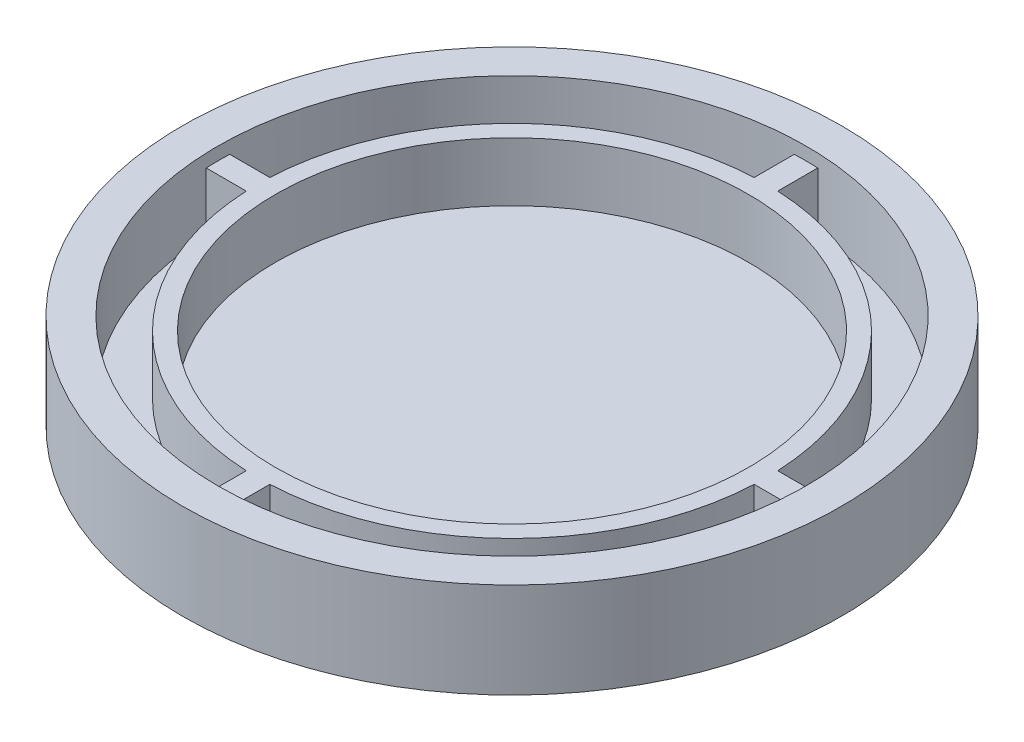
ISO-10303-21;
HEADER;
FILE_DESCRIPTION(('STEP AP214'),'2;1');
FILE_NAME('part.step','',(''),(''),'','','');
FILE_SCHEMA(('AUTOMOTIVE_DESIGN { 1 0 10303 214 1 1 1 1 }'));
ENDSEC;
DATA;
#1=APPLICATION_CONTEXT('core data for automotive mechanical design processes');
#2=APPLICATION_PROTOCOL_DEFINITION('international standard','automotive_design',2000,#1);
#3=PRODUCT_CONTEXT('',#1,'mechanical');
#4=PRODUCT('Part','Part','',(#3));
#5=PRODUCT_RELATED_PRODUCT_CATEGORY('part','',(#4));
#6=PRODUCT_DEFINITION_FORMATION('','',#4);
#7=PRODUCT_DEFINITION_CONTEXT('part definition',#1,'design');
#8=PRODUCT_DEFINITION('design','',#6,#7);
#9=PRODUCT_DEFINITION_SHAPE('','',#8);
#10=(LENGTH_UNIT() NAMED_UNIT(*) SI_UNIT(.MILLI.,.METRE.));
#11=(NAMED_UNIT(*) PLANE_ANGLE_UNIT() SI_UNIT($,.RADIAN.));
#12=(NAMED_UNIT(*) SI_UNIT($,.STERADIAN.) SOLID_ANGLE_UNIT());
#13=UNCERTAINTY_MEASURE_WITH_UNIT(LENGTH_MEASURE(1.E-05),#10,'distance_accuracy_value','');
#14=(GEOMETRIC_REPRESENTATION_CONTEXT(3) GLOBAL_UNCERTAINTY_ASSIGNED_CONTEXT((#13)) GLOBAL_UNIT_ASSIGNED_CONTEXT((#10,
#11,#12)) REPRESENTATION_CONTEXT('',''));
#15=CARTESIAN_POINT('',(0.,0.,0.));
#16=DIRECTION('',(0.,0.,1.));
#17=DIRECTION('',(1.,0.,0.));
#18=AXIS2_PLACEMENT_3D('',#15,#16,#17);
#19=CARTESIAN_POINT('',(0.,8.,0.));
#20=DIRECTION('',(0.,-1.,0.));
#21=DIRECTION('',(0.,0.,-1.));
#22=AXIS2_PLACEMENT_3D('',#19,#20,#21);
#23=CYLINDRICAL_SURFACE('',#22,25.);
#24=CARTESIAN_POINT('',(0.,6.1,0.));
#25=DIRECTION('',(0.,1.,0.));
#26=DIRECTION('',(0.,0.,1.));
#27=AXIS2_PLACEMENT_3D('',#24,#25,#26);
#28=CIRCLE('',#27,25.);
#29=CARTESIAN_POINT('',(0.,6.1,25.));
#30=VERTEX_POINT('',#29);
#31=EDGE_CURVE('E55',#30,#30,#28,.T.);
#32=ORIENTED_EDGE('',*,*,#31,.T.);
#33=EDGE_LOOP('',(#32));
#34=FACE_BOUND('',#33,.T.);
#35=CARTESIAN_POINT('',(0.,5.,0.));
#36=DIRECTION('',(0.,1.,0.));
#37=DIRECTION('',(0.,0.,1.));
#38=AXIS2_PLACEMENT_3D('',#35,#36,#37);
#39=CIRCLE('',#38,25.);
#40=CARTESIAN_POINT('',(24.9799919935936,5.,1.));
#41=VERTEX_POINT('',#40);
#42=CARTESIAN_POINT('',(24.9799919935936,5.,-1.));
#43=VERTEX_POINT('',#42);
#44=EDGE_CURVE('E320',#41,#43,#39,.T.);
#45=ORIENTED_EDGE('',*,*,#44,.F.);
#46=DIRECTION('',(0.,-1.,0.));
#47=VECTOR('',#46,1.);
#48=CARTESIAN_POINT('',(24.9799919935936,8.,1.));
#49=LINE('',#48,#47);
#50=CARTESIAN_POINT('',(24.9799919935936,0.,1.));
#51=VERTEX_POINT('',#50);
#52=EDGE_CURVE('E173',#41,#51,#49,.T.);
#53=ORIENTED_EDGE('',*,*,#52,.T.);
#54=CARTESIAN_POINT('',(0.,0.,0.));
#55=DIRECTION('',(0.,1.,0.));
#56=DIRECTION('',(0.,0.,1.));
#57=AXIS2_PLACEMENT_3D('',#54,#55,#56);
#58=CIRCLE('',#57,25.);
#59=CARTESIAN_POINT('',(1.,0.,24.9799919935936));
#60=VERTEX_POINT('',#59);
#61=EDGE_CURVE('E375',#60,#51,#58,.T.);
#62=ORIENTED_EDGE('',*,*,#61,.F.);
#63=DIRECTION('',(0.,-1.,0.));
#64=VECTOR('',#63,1.);
#65=CARTESIAN_POINT('',(1.,8.,24.9799919935936));
#66=LINE('',#65,#64);
#67=CARTESIAN_POINT('',(1.,5.,24.9799919935936));
#68=VERTEX_POINT('',#67);
#69=EDGE_CURVE('E283',#60,#68,#66,.F.);
#70=ORIENTED_EDGE('',*,*,#69,.T.);
#71=CARTESIAN_POINT('',(0.,5.,0.));
#72=DIRECTION('',(0.,1.,0.));
#73=DIRECTION('',(0.,0.,1.));
#74=AXIS2_PLACEMENT_3D('',#71,#72,#73);
#75=CIRCLE('',#74,25.);
#76=CARTESIAN_POINT('',(-1.,5.,24.9799919935936));
#77=VERTEX_POINT('',#76);
#78=EDGE_CURVE('E261',#77,#68,#75,.T.);
#79=ORIENTED_EDGE('',*,*,#78,.F.);
#80=DIRECTION('',(0.,-1.,0.));
#81=VECTOR('',#80,1.);
#82=CARTESIAN_POINT('',(-1.,8.,24.9799919935936));
#83=LINE('',#82,#81);
#84=CARTESIAN_POINT('',(-1.,0.,24.9799919935936));
#85=VERTEX_POINT('',#84);
#86=EDGE_CURVE('E279',#77,#85,#83,.T.);
#87=ORIENTED_EDGE('',*,*,#86,.T.);
#88=CARTESIAN_POINT('',(-24.9799919935936,0.,1.));
#89=VERTEX_POINT('',#88);
#90=EDGE_CURVE('E61',#89,#85,#58,.T.);
#91=ORIENTED_EDGE('',*,*,#90,.F.);
#92=DIRECTION('',(0.,-1.,0.));
#93=VECTOR('',#92,1.);
#94=CARTESIAN_POINT('',(-24.9799919935936,8.,1.));
#95=LINE('',#94,#93);
#96=CARTESIAN_POINT('',(-24.9799919935936,5.,1.));
#97=VERTEX_POINT('',#96);
#98=EDGE_CURVE('E249',#89,#97,#95,.F.);
#99=ORIENTED_EDGE('',*,*,#98,.T.);
#100=CARTESIAN_POINT('',(0.,5.,0.));
#101=DIRECTION('',(0.,1.,0.));
#102=DIRECTION('',(0.,0.,1.));
#103=AXIS2_PLACEMENT_3D('',#100,#101,#102);
#104=CIRCLE('',#103,25.);
#105=CARTESIAN_POINT('',(-24.9799919935936,5.,-1.));
#106=VERTEX_POINT('',#105);
#107=EDGE_CURVE('E253',#106,#97,#104,.T.);
#108=ORIENTED_EDGE('',*,*,#107,.F.);
#109=DIRECTION('',(0.,-1.,0.));
#110=VECTOR('',#109,1.);
#111=CARTESIAN_POINT('',(-24.9799919935936,8.,-1.));
#112=LINE('',#111,#110);
#113=CARTESIAN_POINT('',(-24.9799919935936,0.,-1.));
#114=VERTEX_POINT('',#113);
#115=EDGE_CURVE('E245',#106,#114,#112,.T.);
#116=ORIENTED_EDGE('',*,*,#115,.T.);
#117=CARTESIAN_POINT('',(-1.,0.,-24.9799919935936));
#118=VERTEX_POINT('',#117);
#119=EDGE_CURVE('E371',#118,#114,#58,.T.);
#120=ORIENTED_EDGE('',*,*,#119,.F.);
#121=DIRECTION('',(0.,-1.,0.));
#122=VECTOR('',#121,1.);
#123=CARTESIAN_POINT('',(-1.,8.,-24.9799919935936));
#124=LINE('',#123,#122);
#125=CARTESIAN_POINT('',(-1.,5.,-24.9799919935936));
#126=VERTEX_POINT('',#125);
#127=EDGE_CURVE('E312',#118,#126,#124,.F.);
#128=ORIENTED_EDGE('',*,*,#127,.T.);
#129=CARTESIAN_POINT('',(0.,5.,0.));
#130=DIRECTION('',(0.,1.,0.));
#131=DIRECTION('',(0.,0.,1.));
#132=AXIS2_PLACEMENT_3D('',#129,#130,#131);
#133=CIRCLE('',#132,25.);
#134=CARTESIAN_POINT('',(1.,5.,-24.9799919935936));
#135=VERTEX_POINT('',#134);
#136=EDGE_CURVE('E292',#135,#126,#133,.T.);
#137=ORIENTED_EDGE('',*,*,#136,.F.);
#138=DIRECTION('',(0.,-1.,0.));
#139=VECTOR('',#138,1.);
#140=CARTESIAN_POINT('',(1.,8.,-24.9799919935936));
#141=LINE('',#140,#139);
#142=CARTESIAN_POINT('',(1.,0.,-24.9799919935936));
#143=VERTEX_POINT('',#142);
#144=EDGE_CURVE('E308',#135,#143,#141,.T.);
#145=ORIENTED_EDGE('',*,*,#144,.T.);
#146=CARTESIAN_POINT('',(24.9799919935936,0.,-1.));
#147=VERTEX_POINT('',#146);
#148=EDGE_CURVE('E359',#147,#143,#58,.T.);
#149=ORIENTED_EDGE('',*,*,#148,.F.);
#150=DIRECTION('',(0.,-1.,0.));
#151=VECTOR('',#150,1.);
#152=CARTESIAN_POINT('',(24.9799919935936,8.,-1.));
#153=LINE('',#152,#151);
#154=EDGE_CURVE('E178',#147,#43,#153,.F.);
#155=ORIENTED_EDGE('',*,*,#154,.T.);
#156=EDGE_LOOP('',(#45,#53,#62,#70,#79,#87,#91,#99,#108,#116,#120,#128,#137,#145,#149,#155));
#157=FACE_BOUND('',#156,.T.);
#158=ADVANCED_FACE('F51',(#34,#157),#23,.F.);
#159=CARTESIAN_POINT('',(0.,0.,0.));
#160=DIRECTION('',(0.,1.,0.));
#161=DIRECTION('',(0.,0.,1.));
#162=AXIS2_PLACEMENT_3D('',#159,#160,#161);
#163=PLANE('',#162);
#164=ORIENTED_EDGE('',*,*,#61,.T.);
#165=DIRECTION('',(1.,0.,0.));
#166=VECTOR('',#165,1.);
#167=CARTESIAN_POINT('',(21.5768394349126,0.,1.));
#168=LINE('',#167,#166);
#169=CARTESIAN_POINT('',(21.5768394349126,0.,1.));
#170=VERTEX_POINT('',#169);
#171=EDGE_CURVE('E190',#170,#51,#168,.T.);
#172=ORIENTED_EDGE('',*,*,#171,.F.);
#173=CARTESIAN_POINT('',(0.,0.,0.));
#174=DIRECTION('',(0.,1.,0.));
#175=DIRECTION('',(0.,0.,1.));
#176=AXIS2_PLACEMENT_3D('',#173,#174,#175);
#177=CIRCLE('',#176,21.6);
#178=CARTESIAN_POINT('',(1.,0.,21.5768394349126));
#179=VERTEX_POINT('',#178);
#180=EDGE_CURVE('E188',#179,#170,#177,.T.);
#181=ORIENTED_EDGE('',*,*,#180,.F.);
#182=DIRECTION('',(0.,0.,-1.));
#183=VECTOR('',#182,1.);
#184=CARTESIAN_POINT('',(1.,0.,21.5768394349126));
#185=LINE('',#184,#183);
#186=EDGE_CURVE('E298',#60,#179,#185,.T.);
#187=ORIENTED_EDGE('',*,*,#186,.F.);
#188=EDGE_LOOP('',(#164,#172,#181,#187));
#189=FACE_BOUND('',#188,.T.);
#190=ADVANCED_FACE('F411',(#189),#163,.T.);
#191=CARTESIAN_POINT('',(21.5768394349126,0.,-1.));
#192=VERTEX_POINT('',#191);
#193=CARTESIAN_POINT('',(1.,0.,-21.5768394349126));
#194=VERTEX_POINT('',#193);
#195=EDGE_CURVE('E215',#192,#194,#177,.T.);
#196=ORIENTED_EDGE('',*,*,#195,.F.);
#197=DIRECTION('',(-1.,0.,0.));
#198=VECTOR('',#197,1.);
#199=CARTESIAN_POINT('',(21.5768394349126,0.,-1.));
#200=LINE('',#199,#198);
#201=EDGE_CURVE('E346',#147,#192,#200,.T.);
#202=ORIENTED_EDGE('',*,*,#201,.F.);
#203=ORIENTED_EDGE('',*,*,#148,.T.);
#204=DIRECTION('',(0.,0.,-1.));
#205=VECTOR('',#204,1.);
#206=CARTESIAN_POINT('',(1.,0.,-21.5768394349126));
#207=LINE('',#206,#205);
#208=EDGE_CURVE('E323',#194,#143,#207,.T.);
#209=ORIENTED_EDGE('',*,*,#208,.F.);
#210=EDGE_LOOP('',(#196,#202,#203,#209));
#211=FACE_BOUND('',#210,.T.);
#212=ADVANCED_FACE('F358',(#211),#163,.T.);
#213=CARTESIAN_POINT('',(0.,5.,0.));
#214=DIRECTION('',(0.,-1.,0.));
#215=DIRECTION('',(0.,0.,-1.));
#216=AXIS2_PLACEMENT_3D('',#213,#214,#215);
#217=CYLINDRICAL_SURFACE('',#216,21.6);
#218=DIRECTION('',(0.,-1.,0.));
#219=VECTOR('',#218,1.);
#220=CARTESIAN_POINT('',(21.5768394349126,8.96459685899707,1.));
#221=LINE('',#220,#219);
#222=CARTESIAN_POINT('',(21.5768394349126,5.,1.));
#223=VERTEX_POINT('',#222);
#224=EDGE_CURVE('E170',#223,#170,#221,.T.);
#225=ORIENTED_EDGE('',*,*,#224,.F.);
#226=CARTESIAN_POINT('',(0.,5.,0.));
#227=DIRECTION('',(0.,1.,0.));
#228=DIRECTION('',(0.,0.,1.));
#229=AXIS2_PLACEMENT_3D('',#226,#227,#228);
#230=CIRCLE('',#229,21.6);
#231=CARTESIAN_POINT('',(1.,5.,21.5768394349126));
#232=VERTEX_POINT('',#231);
#233=EDGE_CURVE('E186',#232,#223,#230,.T.);
#234=ORIENTED_EDGE('',*,*,#233,.F.);
#235=DIRECTION('',(0.,-1.,0.));
#236=VECTOR('',#235,1.);
#237=CARTESIAN_POINT('',(1.,8.96459685899707,21.5768394349126));
#238=LINE('',#237,#236);
#239=EDGE_CURVE('E288',#232,#179,#238,.T.);
#240=ORIENTED_EDGE('',*,*,#239,.T.);
#241=ORIENTED_EDGE('',*,*,#180,.T.);
#242=EDGE_LOOP('',(#225,#234,#240,#241));
#243=FACE_BOUND('',#242,.T.);
#244=ADVANCED_FACE('F184',(#243),#217,.T.);
#245=DIRECTION('',(0.,-1.,0.));
#246=VECTOR('',#245,1.);
#247=CARTESIAN_POINT('',(21.5768394349126,8.96459685899707,-1.));
#248=LINE('',#247,#246);
#249=CARTESIAN_POINT('',(21.5768394349126,5.,-1.));
#250=VERTEX_POINT('',#249);
#251=EDGE_CURVE('E68',#250,#192,#248,.T.);
#252=ORIENTED_EDGE('',*,*,#251,.T.);
#253=ORIENTED_EDGE('',*,*,#195,.T.);
#254=DIRECTION('',(0.,-1.,0.));
#255=VECTOR('',#254,1.);
#256=CARTESIAN_POINT('',(1.,8.96459685899707,-21.5768394349126));
#257=LINE('',#256,#255);
#258=CARTESIAN_POINT('',(1.,5.,-21.5768394349126));
#259=VERTEX_POINT('',#258);
#260=EDGE_CURVE('E319',#259,#194,#257,.T.);
#261=ORIENTED_EDGE('',*,*,#260,.F.);
#262=EDGE_CURVE('E199',#250,#259,#230,.T.);
#263=ORIENTED_EDGE('',*,*,#262,.F.);
#264=EDGE_LOOP('',(#252,#253,#261,#263));
#265=FACE_BOUND('',#264,.T.);
#266=ADVANCED_FACE('F356',(#265),#217,.T.);
#267=CARTESIAN_POINT('',(-1.,0.,-21.5768394349126));
#268=VERTEX_POINT('',#267);
#269=CARTESIAN_POINT('',(-21.5768394349126,0.,-1.));
#270=VERTEX_POINT('',#269);
#271=EDGE_CURVE('E221',#268,#270,#177,.T.);
#272=ORIENTED_EDGE('',*,*,#271,.F.);
#273=DIRECTION('',(0.,0.,1.));
#274=VECTOR('',#273,1.);
#275=CARTESIAN_POINT('',(-1.,0.,-21.5768394349126));
#276=LINE('',#275,#274);
#277=EDGE_CURVE('E327',#118,#268,#276,.T.);
#278=ORIENTED_EDGE('',*,*,#277,.F.);
#279=ORIENTED_EDGE('',*,*,#119,.T.);
#280=DIRECTION('',(-1.,0.,0.));
#281=VECTOR('',#280,1.);
#282=CARTESIAN_POINT('',(-21.5768394349126,0.,-1.));
#283=LINE('',#282,#281);
#284=EDGE_CURVE('E264',#270,#114,#283,.T.);
#285=ORIENTED_EDGE('',*,*,#284,.F.);
#286=EDGE_LOOP('',(#272,#278,#279,#285));
#287=FACE_BOUND('',#286,.T.);
#288=ADVANCED_FACE('F369',(#287),#163,.T.);
#289=DIRECTION('',(0.,-1.,0.));
#290=VECTOR('',#289,1.);
#291=CARTESIAN_POINT('',(-1.,8.96459685899707,-21.5768394349126));
#292=LINE('',#291,#290);
#293=CARTESIAN_POINT('',(-1.,5.,-21.5768394349126));
#294=VERTEX_POINT('',#293);
#295=EDGE_CURVE('E76',#294,#268,#292,.T.);
#296=ORIENTED_EDGE('',*,*,#295,.T.);
#297=ORIENTED_EDGE('',*,*,#271,.T.);
#298=DIRECTION('',(0.,-1.,0.));
#299=VECTOR('',#298,1.);
#300=CARTESIAN_POINT('',(-21.5768394349126,8.96459685899707,-1.));
#301=LINE('',#300,#299);
#302=CARTESIAN_POINT('',(-21.5768394349126,5.,-1.));
#303=VERTEX_POINT('',#302);
#304=EDGE_CURVE('E260',#303,#270,#301,.T.);
#305=ORIENTED_EDGE('',*,*,#304,.F.);
#306=EDGE_CURVE('E201',#294,#303,#230,.T.);
#307=ORIENTED_EDGE('',*,*,#306,.F.);
#308=EDGE_LOOP('',(#296,#297,#305,#307));
#309=FACE_BOUND('',#308,.T.);
#310=ADVANCED_FACE('F419',(#309),#217,.T.);
#311=ORIENTED_EDGE('',*,*,#90,.T.);
#312=DIRECTION('',(0.,0.,1.));
#313=VECTOR('',#312,1.);
#314=CARTESIAN_POINT('',(-1.,0.,21.5768394349126));
#315=LINE('',#314,#313);
#316=CARTESIAN_POINT('',(-1.,0.,21.5768394349126));
#317=VERTEX_POINT('',#316);
#318=EDGE_CURVE('E295',#317,#85,#315,.T.);
#319=ORIENTED_EDGE('',*,*,#318,.F.);
#320=CARTESIAN_POINT('',(-21.5768394349126,0.,1.));
#321=VERTEX_POINT('',#320);
#322=EDGE_CURVE('E209',#321,#317,#177,.T.);
#323=ORIENTED_EDGE('',*,*,#322,.F.);
#324=DIRECTION('',(1.,0.,0.));
#325=VECTOR('',#324,1.);
#326=CARTESIAN_POINT('',(-21.5768394349126,0.,1.));
#327=LINE('',#326,#325);
#328=EDGE_CURVE('E269',#89,#321,#327,.T.);
#329=ORIENTED_EDGE('',*,*,#328,.F.);
#330=EDGE_LOOP('',(#311,#319,#323,#329));
#331=FACE_BOUND('',#330,.T.);
#332=ADVANCED_FACE('F390',(#331),#163,.T.);
#333=DIRECTION('',(0.,-1.,0.));
#334=VECTOR('',#333,1.);
#335=CARTESIAN_POINT('',(-1.,8.96459685899707,21.5768394349126));
#336=LINE('',#335,#334);
#337=CARTESIAN_POINT('',(-1.,5.,21.5768394349126));
#338=VERTEX_POINT('',#337);
#339=EDGE_CURVE('E291',#338,#317,#336,.T.);
#340=ORIENTED_EDGE('',*,*,#339,.F.);
#341=CARTESIAN_POINT('',(-21.5768394349126,5.,0.999999999999985));
#342=VERTEX_POINT('',#341);
#343=EDGE_CURVE('E198',#342,#338,#230,.T.);
#344=ORIENTED_EDGE('',*,*,#343,.F.);
#345=DIRECTION('',(0.,-1.,0.));
#346=VECTOR('',#345,1.);
#347=CARTESIAN_POINT('',(-21.5768394349126,8.96459685899707,1.));
#348=LINE('',#347,#346);
#349=EDGE_CURVE('E257',#342,#321,#348,.T.);
#350=ORIENTED_EDGE('',*,*,#349,.T.);
#351=ORIENTED_EDGE('',*,*,#322,.T.);
#352=EDGE_LOOP('',(#340,#344,#350,#351));
#353=FACE_BOUND('',#352,.T.);
#354=ADVANCED_FACE('F396',(#353),#217,.T.);
#355=CARTESIAN_POINT('',(0.,5.,0.));
#356=DIRECTION('',(0.,1.,0.));
#357=DIRECTION('',(0.,0.,1.));
#358=AXIS2_PLACEMENT_3D('',#355,#356,#357);
#359=PLANE('',#358);
#360=ORIENTED_EDGE('',*,*,#233,.T.);
#361=DIRECTION('',(1.,0.,0.));
#362=VECTOR('',#361,1.);
#363=CARTESIAN_POINT('',(21.5768394349126,5.,1.));
#364=LINE('',#363,#362);
#365=EDGE_CURVE('E167',#223,#41,#364,.T.);
#366=ORIENTED_EDGE('',*,*,#365,.T.);
#367=ORIENTED_EDGE('',*,*,#44,.T.);
#368=DIRECTION('',(-1.,0.,0.));
#369=VECTOR('',#368,1.);
#370=CARTESIAN_POINT('',(21.5768394349126,5.,-1.));
#371=LINE('',#370,#369);
#372=EDGE_CURVE('E179',#43,#250,#371,.T.);
#373=ORIENTED_EDGE('',*,*,#372,.T.);
#374=ORIENTED_EDGE('',*,*,#262,.T.);
#375=DIRECTION('',(0.,0.,-1.));
#376=VECTOR('',#375,1.);
#377=CARTESIAN_POINT('',(1.,5.,-21.5768394349126));
#378=LINE('',#377,#376);
#379=EDGE_CURVE('E316',#259,#135,#378,.T.);
#380=ORIENTED_EDGE('',*,*,#379,.T.);
#381=ORIENTED_EDGE('',*,*,#136,.T.);
#382=DIRECTION('',(0.,0.,1.));
#383=VECTOR('',#382,1.);
#384=CARTESIAN_POINT('',(-1.,5.,-21.5768394349126));
#385=LINE('',#384,#383);
#386=EDGE_CURVE('E324',#126,#294,#385,.T.);
#387=ORIENTED_EDGE('',*,*,#386,.T.);
#388=ORIENTED_EDGE('',*,*,#306,.T.);
#389=DIRECTION('',(-1.,0.,0.));
#390=VECTOR('',#389,1.);
#391=CARTESIAN_POINT('',(-21.5768394349126,5.,-1.));
#392=LINE('',#391,#390);
#393=EDGE_CURVE('E256',#303,#106,#392,.T.);
#394=ORIENTED_EDGE('',*,*,#393,.T.);
#395=ORIENTED_EDGE('',*,*,#107,.T.);
#396=DIRECTION('',(1.,0.,0.));
#397=VECTOR('',#396,1.);
#398=CARTESIAN_POINT('',(-21.5768394349126,5.,1.));
#399=LINE('',#398,#397);
#400=EDGE_CURVE('E265',#97,#342,#399,.T.);
#401=ORIENTED_EDGE('',*,*,#400,.T.);
#402=ORIENTED_EDGE('',*,*,#343,.T.);
#403=DIRECTION('',(0.,0.,1.));
#404=VECTOR('',#403,1.);
#405=CARTESIAN_POINT('',(-1.,5.,21.5768394349126));
#406=LINE('',#405,#404);
#407=EDGE_CURVE('E287',#338,#77,#406,.T.);
#408=ORIENTED_EDGE('',*,*,#407,.T.);
#409=ORIENTED_EDGE('',*,*,#78,.T.);
#410=DIRECTION('',(0.,0.,-1.));
#411=VECTOR('',#410,1.);
#412=CARTESIAN_POINT('',(1.,5.,21.5768394349126));
#413=LINE('',#412,#411);
#414=EDGE_CURVE('E196',#68,#232,#413,.T.);
#415=ORIENTED_EDGE('',*,*,#414,.T.);
#416=EDGE_LOOP('',(#360,#366,#367,#373,#374,#380,#381,#387,#388,#394,#395,#401,#402,#408,#409,#415));
#417=FACE_BOUND('',#416,.T.);
#418=CARTESIAN_POINT('',(0.,5.,0.));
#419=DIRECTION('',(0.,1.,0.));
#420=DIRECTION('',(0.,0.,1.));
#421=AXIS2_PLACEMENT_3D('',#418,#419,#420);
#422=CIRCLE('',#421,20.1);
#423=CARTESIAN_POINT('',(0.,5.,20.1));
#424=VERTEX_POINT('',#423);
#425=EDGE_CURVE('E229',#424,#424,#422,.T.);
#426=ORIENTED_EDGE('',*,*,#425,.F.);
#427=EDGE_LOOP('',(#426));
#428=FACE_BOUND('',#427,.T.);
#429=ADVANCED_FACE('F193',(#417,#428),#359,.T.);
#430=CARTESIAN_POINT('',(0.,5.,0.));
#431=DIRECTION('',(0.,-1.,0.));
#432=DIRECTION('',(0.,0.,-1.));
#433=AXIS2_PLACEMENT_3D('',#430,#431,#432);
#434=CYLINDRICAL_SURFACE('',#433,20.1);
#435=ORIENTED_EDGE('',*,*,#425,.T.);
#436=EDGE_LOOP('',(#435));
#437=FACE_BOUND('',#436,.T.);
#438=CARTESIAN_POINT('',(0.,0.,0.));
#439=DIRECTION('',(0.,1.,0.));
#440=DIRECTION('',(0.,0.,1.));
#441=AXIS2_PLACEMENT_3D('',#438,#439,#440);
#442=CIRCLE('',#441,20.1);
#443=CARTESIAN_POINT('',(0.,0.,20.1));
#444=VERTEX_POINT('',#443);
#445=EDGE_CURVE('E12',#444,#444,#442,.F.);
#446=ORIENTED_EDGE('',*,*,#445,.T.);
#447=EDGE_LOOP('',(#446));
#448=FACE_BOUND('',#447,.T.);
#449=ADVANCED_FACE('F430',(#437,#448),#434,.F.);
#450=ORIENTED_EDGE('',*,*,#445,.F.);
#451=EDGE_LOOP('',(#450));
#452=FACE_BOUND('',#451,.T.);
#453=ADVANCED_FACE('F420',(#452),#163,.T.);
#454=CARTESIAN_POINT('',(0.,6.1,0.));
#455=DIRECTION('',(0.,1.,0.));
#456=DIRECTION('',(0.,0.,1.));
#457=AXIS2_PLACEMENT_3D('',#454,#455,#456);
#458=PLANE('',#457);
#459=ORIENTED_EDGE('',*,*,#31,.F.);
#460=EDGE_LOOP('',(#459));
#461=FACE_BOUND('',#460,.T.);
#462=CARTESIAN_POINT('',(0.,6.1,0.));
#463=DIRECTION('',(0.,1.,0.));
#464=DIRECTION('',(0.,0.,1.));
#465=AXIS2_PLACEMENT_3D('',#462,#463,#464);
#466=CIRCLE('',#465,28.);
#467=CARTESIAN_POINT('',(0.,6.1,28.));
#468=VERTEX_POINT('',#467);
#469=EDGE_CURVE('E240',#468,#468,#466,.T.);
#470=ORIENTED_EDGE('',*,*,#469,.T.);
#471=EDGE_LOOP('',(#470));
#472=FACE_BOUND('',#471,.T.);
#473=ADVANCED_FACE('F424',(#461,#472),#458,.T.);
#474=CARTESIAN_POINT('',(0.,-2.,0.));
#475=DIRECTION('',(0.,1.,0.));
#476=DIRECTION('',(0.,0.,1.));
#477=AXIS2_PLACEMENT_3D('',#474,#475,#476);
#478=PLANE('',#477);
#479=CARTESIAN_POINT('',(0.,-2.,0.));
#480=DIRECTION('',(0.,1.,0.));
#481=DIRECTION('',(0.,0.,1.));
#482=AXIS2_PLACEMENT_3D('',#479,#480,#481);
#483=CIRCLE('',#482,28.);
#484=CARTESIAN_POINT('',(0.,-2.,28.));
#485=VERTEX_POINT('',#484);
#486=EDGE_CURVE('E205',#485,#485,#483,.T.);
#487=ORIENTED_EDGE('',*,*,#486,.F.);
#488=EDGE_LOOP('',(#487));
#489=FACE_BOUND('',#488,.T.);
#490=ADVANCED_FACE('F421',(#489),#478,.F.);
#491=CARTESIAN_POINT('',(0.,8.,0.));
#492=DIRECTION('',(0.,-1.,0.));
#493=DIRECTION('',(0.,0.,-1.));
#494=AXIS2_PLACEMENT_3D('',#491,#492,#493);
#495=CYLINDRICAL_SURFACE('',#494,28.);
#496=ORIENTED_EDGE('',*,*,#486,.T.);
#497=EDGE_LOOP('',(#496));
#498=FACE_BOUND('',#497,.T.);
#499=ORIENTED_EDGE('',*,*,#469,.F.);
#500=EDGE_LOOP('',(#499));
#501=FACE_BOUND('',#500,.T.);
#502=ADVANCED_FACE('F53',(#498,#501),#495,.T.);
#503=CARTESIAN_POINT('',(-21.5768394349126,8.96459685899707,-1.));
#504=DIRECTION('',(0.,0.,1.));
#505=DIRECTION('',(1.,0.,0.));
#506=AXIS2_PLACEMENT_3D('',#503,#504,#505);
#507=PLANE('',#506);
#508=ORIENTED_EDGE('',*,*,#115,.F.);
#509=ORIENTED_EDGE('',*,*,#393,.F.);
#510=ORIENTED_EDGE('',*,*,#304,.T.);
#511=ORIENTED_EDGE('',*,*,#284,.T.);
#512=EDGE_LOOP('',(#508,#509,#510,#511));
#513=FACE_BOUND('',#512,.T.);
#514=ADVANCED_FACE('F400',(#513),#507,.F.);
#515=CARTESIAN_POINT('',(-21.5768394349126,8.96459685899707,1.));
#516=DIRECTION('',(0.,0.,-1.));
#517=DIRECTION('',(-1.,0.,0.));
#518=AXIS2_PLACEMENT_3D('',#515,#516,#517);
#519=PLANE('',#518);
#520=ORIENTED_EDGE('',*,*,#98,.F.);
#521=ORIENTED_EDGE('',*,*,#328,.T.);
#522=ORIENTED_EDGE('',*,*,#349,.F.);
#523=ORIENTED_EDGE('',*,*,#400,.F.);
#524=EDGE_LOOP('',(#520,#521,#522,#523));
#525=FACE_BOUND('',#524,.T.);
#526=ADVANCED_FACE('F398',(#525),#519,.F.);
#527=CARTESIAN_POINT('',(-1.,8.96459685899707,21.5768394349126));
#528=DIRECTION('',(1.,0.,0.));
#529=DIRECTION('',(0.,0.,-1.));
#530=AXIS2_PLACEMENT_3D('',#527,#528,#529);
#531=PLANE('',#530);
#532=ORIENTED_EDGE('',*,*,#86,.F.);
#533=ORIENTED_EDGE('',*,*,#407,.F.);
#534=ORIENTED_EDGE('',*,*,#339,.T.);
#535=ORIENTED_EDGE('',*,*,#318,.T.);
#536=EDGE_LOOP('',(#532,#533,#534,#535));
#537=FACE_BOUND('',#536,.T.);
#538=ADVANCED_FACE('F393',(#537),#531,.F.);
#539=CARTESIAN_POINT('',(1.,8.96459685899707,21.5768394349126));
#540=DIRECTION('',(-1.,0.,0.));
#541=DIRECTION('',(0.,0.,1.));
#542=AXIS2_PLACEMENT_3D('',#539,#540,#541);
#543=PLANE('',#542);
#544=ORIENTED_EDGE('',*,*,#69,.F.);
#545=ORIENTED_EDGE('',*,*,#186,.T.);
#546=ORIENTED_EDGE('',*,*,#239,.F.);
#547=ORIENTED_EDGE('',*,*,#414,.F.);
#548=EDGE_LOOP('',(#544,#545,#546,#547));
#549=FACE_BOUND('',#548,.T.);
#550=ADVANCED_FACE('F406',(#549),#543,.F.);
#551=CARTESIAN_POINT('',(1.,8.96459685899707,-21.5768394349126));
#552=DIRECTION('',(-1.,0.,0.));
#553=DIRECTION('',(0.,0.,1.));
#554=AXIS2_PLACEMENT_3D('',#551,#552,#553);
#555=PLANE('',#554);
#556=ORIENTED_EDGE('',*,*,#144,.F.);
#557=ORIENTED_EDGE('',*,*,#379,.F.);
#558=ORIENTED_EDGE('',*,*,#260,.T.);
#559=ORIENTED_EDGE('',*,*,#208,.T.);
#560=EDGE_LOOP('',(#556,#557,#558,#559));
#561=FACE_BOUND('',#560,.T.);
#562=ADVANCED_FACE('F361',(#561),#555,.F.);
#563=CARTESIAN_POINT('',(-1.,8.96459685899707,-21.5768394349126));
#564=DIRECTION('',(1.,0.,0.));
#565=DIRECTION('',(0.,0.,-1.));
#566=AXIS2_PLACEMENT_3D('',#563,#564,#565);
#567=PLANE('',#566);
#568=ORIENTED_EDGE('',*,*,#127,.F.);
#569=ORIENTED_EDGE('',*,*,#277,.T.);
#570=ORIENTED_EDGE('',*,*,#295,.F.);
#571=ORIENTED_EDGE('',*,*,#386,.F.);
#572=EDGE_LOOP('',(#568,#569,#570,#571));
#573=FACE_BOUND('',#572,.T.);
#574=ADVANCED_FACE('F366',(#573),#567,.F.);
#575=CARTESIAN_POINT('',(21.5768394349126,8.96459685899707,1.));
#576=DIRECTION('',(0.,0.,-1.));
#577=DIRECTION('',(-1.,0.,0.));
#578=AXIS2_PLACEMENT_3D('',#575,#576,#577);
#579=PLANE('',#578);
#580=ORIENTED_EDGE('',*,*,#52,.F.);
#581=ORIENTED_EDGE('',*,*,#365,.F.);
#582=ORIENTED_EDGE('',*,*,#224,.T.);
#583=ORIENTED_EDGE('',*,*,#171,.T.);
#584=EDGE_LOOP('',(#580,#581,#582,#583));
#585=FACE_BOUND('',#584,.T.);
#586=ADVANCED_FACE('F169',(#585),#579,.F.);
#587=CARTESIAN_POINT('',(21.5768394349126,8.96459685899707,-1.));
#588=DIRECTION('',(0.,0.,1.));
#589=DIRECTION('',(1.,0.,0.));
#590=AXIS2_PLACEMENT_3D('',#587,#588,#589);
#591=PLANE('',#590);
#592=ORIENTED_EDGE('',*,*,#154,.F.);
#593=ORIENTED_EDGE('',*,*,#201,.T.);
#594=ORIENTED_EDGE('',*,*,#251,.F.);
#595=ORIENTED_EDGE('',*,*,#372,.F.);
#596=EDGE_LOOP('',(#592,#593,#594,#595));
#597=FACE_BOUND('',#596,.T.);
#598=ADVANCED_FACE('F352',(#597),#591,.F.);
#599=CLOSED_SHELL('',(#158,#190,#212,#244,#266,#288,#310,#332,#354,#429,#449,#453,#473,#490,
#502,#514,#526,#538,#550,#562,#574,#586,#598));
#600=MANIFOLD_SOLID_BREP('B2',#599);
#601=ADVANCED_BREP_SHAPE_REPRESENTATION('',(#18,#600),#14);
#602=SHAPE_DEFINITION_REPRESENTATION(#9,#601);
ENDSEC;
END-ISO-10303-21;
